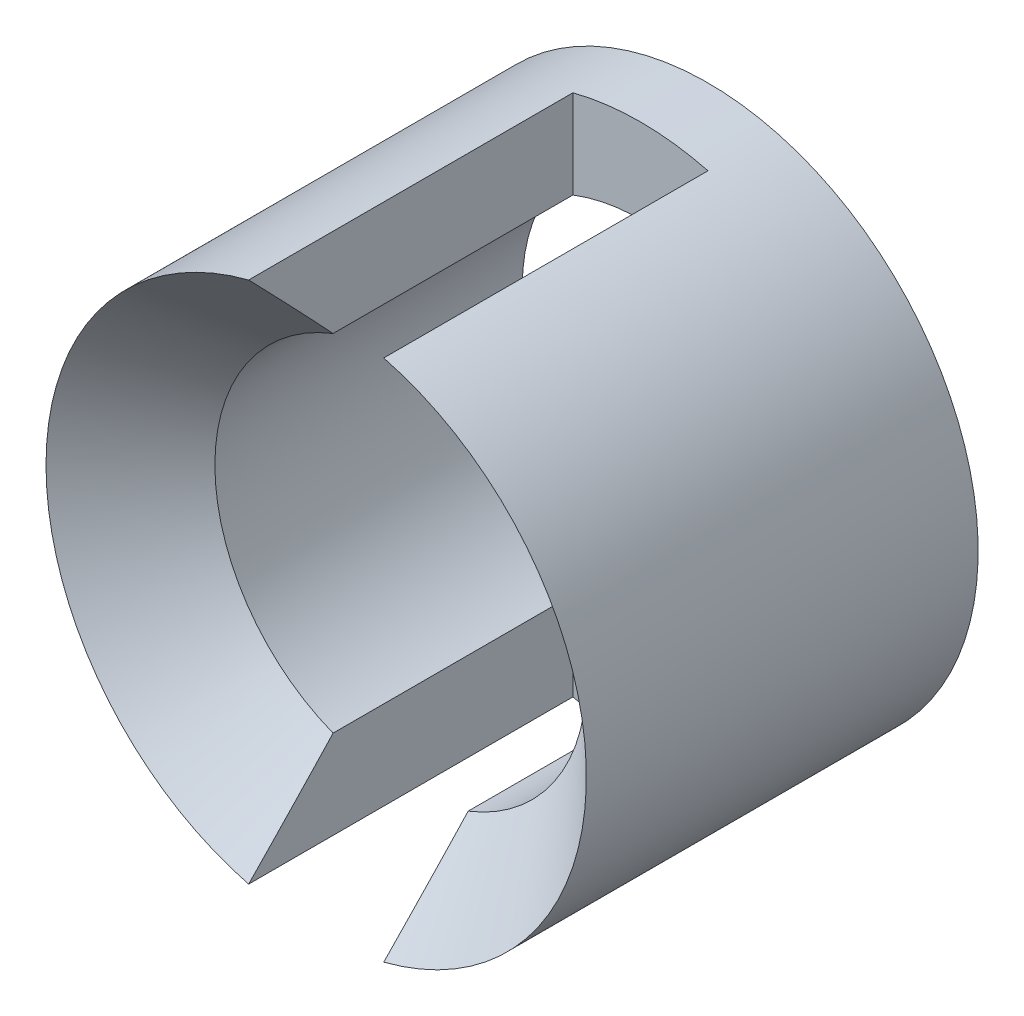
ISO-10303-21;
HEADER;
FILE_DESCRIPTION(('STEP AP214'),'2;1');
FILE_NAME('part.step','',(''),(''),'','','');
FILE_SCHEMA(('AUTOMOTIVE_DESIGN { 1 0 10303 214 1 1 1 1 }'));
ENDSEC;
DATA;
#1=APPLICATION_CONTEXT('core data for automotive mechanical design processes');
#2=APPLICATION_PROTOCOL_DEFINITION('international standard','automotive_design',2000,#1);
#3=PRODUCT_CONTEXT('',#1,'mechanical');
#4=PRODUCT('Part','Part','',(#3));
#5=PRODUCT_RELATED_PRODUCT_CATEGORY('part','',(#4));
#6=PRODUCT_DEFINITION_FORMATION('','',#4);
#7=PRODUCT_DEFINITION_CONTEXT('part definition',#1,'design');
#8=PRODUCT_DEFINITION('design','',#6,#7);
#9=PRODUCT_DEFINITION_SHAPE('','',#8);
#10=(LENGTH_UNIT() NAMED_UNIT(*) SI_UNIT(.MILLI.,.METRE.));
#11=(NAMED_UNIT(*) PLANE_ANGLE_UNIT() SI_UNIT($,.RADIAN.));
#12=(NAMED_UNIT(*) SI_UNIT($,.STERADIAN.) SOLID_ANGLE_UNIT());
#13=UNCERTAINTY_MEASURE_WITH_UNIT(LENGTH_MEASURE(1.E-05),#10,'distance_accuracy_value','');
#14=(GEOMETRIC_REPRESENTATION_CONTEXT(3) GLOBAL_UNCERTAINTY_ASSIGNED_CONTEXT((#13)) GLOBAL_UNIT_ASSIGNED_CONTEXT((#10,
#11,#12)) REPRESENTATION_CONTEXT('',''));
#15=CARTESIAN_POINT('',(0.,0.,0.));
#16=DIRECTION('',(0.,0.,1.));
#17=DIRECTION('',(1.,0.,0.));
#18=AXIS2_PLACEMENT_3D('',#15,#16,#17);
#19=CARTESIAN_POINT('',(52.,0.,35.));
#20=DIRECTION('',(0.,0.,1.));
#21=DIRECTION('',(1.,0.,0.));
#22=AXIS2_PLACEMENT_3D('',#19,#20,#21);
#23=CONICAL_SURFACE('',#22,5.2,0.785398163397448);
#24=CARTESIAN_POINT('',(53.,-3.87370629888224,33.8007));
#25=CARTESIAN_POINT('',(53.,-3.78377847794589,33.7136281605372));
#26=CARTESIAN_POINT('',(53.,-3.69375826152483,33.6266520425625));
#27=CARTESIAN_POINT('',(53.,-3.51348257523246,33.452941561294));
#28=CARTESIAN_POINT('',(53.,-3.42322710220079,33.3662072012807));
#29=CARTESIAN_POINT('',(53.,-3.15193307704452,33.1063474084039));
#30=CARTESIAN_POINT('',(53.,-2.97046894641193,32.9336642756475));
#31=CARTESIAN_POINT('',(53.,-2.69877195793612,32.6779298111269));
#32=CARTESIAN_POINT('',(53.,-2.60925278290297,32.5941206006967));
#33=CARTESIAN_POINT('',(53.,-2.42961319121391,32.4271495738231));
#34=CARTESIAN_POINT('',(53.,-2.33949278018787,32.3439877513334));
#35=CARTESIAN_POINT('',(53.,-2.15846162379619,32.1785719304018));
#36=CARTESIAN_POINT('',(53.,-2.06755107551995,32.096317716564));
#37=CARTESIAN_POINT('',(53.,-1.88460197739564,31.9330743131938));
#38=CARTESIAN_POINT('',(53.,-1.79256347284042,31.8520850731617));
#39=CARTESIAN_POINT('',(53.,-1.64554639333561,31.7253768657511));
#40=CARTESIAN_POINT('',(53.,-1.59111153800493,31.6790278264151));
#41=CARTESIAN_POINT('',(53.,-1.48151988478831,31.587177822305));
#42=CARTESIAN_POINT('',(53.,-1.42636301716185,31.5416769405005));
#43=CARTESIAN_POINT('',(53.,-1.3145253649584,31.4513260014455));
#44=CARTESIAN_POINT('',(53.,-1.25783454923191,31.4064883116032));
#45=CARTESIAN_POINT('',(53.,-1.14321925252981,31.3184211843103));
#46=CARTESIAN_POINT('',(53.,-1.08529490458923,31.2751915747975));
#47=CARTESIAN_POINT('',(53.,-0.966870518316472,31.1903593900541));
#48=CARTESIAN_POINT('',(53.,-0.906344320623961,31.1487930101723));
#49=CARTESIAN_POINT('',(53.,-0.782893162532452,31.0691304507892));
#50=CARTESIAN_POINT('',(53.,-0.71996508720968,31.0310390108286));
#51=CARTESIAN_POINT('',(53.,-0.591863597012872,30.960800107427));
#52=CARTESIAN_POINT('',(53.,-0.526729355427893,30.9285826438723));
#53=CARTESIAN_POINT('',(53.,-0.3929118591497,30.8727214403211));
#54=CARTESIAN_POINT('',(53.,-0.324241529903425,30.8490487006837));
#55=CARTESIAN_POINT('',(53.,-0.221184627158728,30.8236740525048));
#56=CARTESIAN_POINT('',(53.,-0.188023002282163,30.8169859937058));
#57=CARTESIAN_POINT('',(53.,-0.121206142014899,30.8067784844959));
#58=CARTESIAN_POINT('',(53.,-0.0875509450036839,30.8032587890312));
#59=CARTESIAN_POINT('',(53.,-0.0201426921737823,30.7996385884502));
#60=CARTESIAN_POINT('',(53.,0.0136098619022317,30.7995289726332));
#61=CARTESIAN_POINT('',(53.,0.0809476049092378,30.8027050580893));
#62=CARTESIAN_POINT('',(53.,0.114532778163754,30.8059910715994));
#63=CARTESIAN_POINT('',(53.,0.213951812975935,30.8205519989456));
#64=CARTESIAN_POINT('',(53.,0.279130544840012,30.8365003156888));
#65=CARTESIAN_POINT('',(53.,0.374620648857944,30.8674317069862));
#66=CARTESIAN_POINT('',(53.,0.40616696948862,30.8789579181276));
#67=CARTESIAN_POINT('',(53.,0.468488884656917,30.903935312644));
#68=CARTESIAN_POINT('',(53.,0.49926464010403,30.9173860901245));
#69=CARTESIAN_POINT('',(53.,0.592440527855131,30.9609869818209));
#70=CARTESIAN_POINT('',(53.,0.653643966712842,30.9936762384502));
#71=CARTESIAN_POINT('',(53.,0.773581167652545,31.0633487077666));
#72=CARTESIAN_POINT('',(53.,0.832311709344529,31.1003372972856));
#73=CARTESIAN_POINT('',(53.,0.948093136294809,31.1773186573655));
#74=CARTESIAN_POINT('',(53.,1.00513632967926,31.2173228950895));
#75=CARTESIAN_POINT('',(53.,1.11774208035632,31.2992869072952));
#76=CARTESIAN_POINT('',(53.,1.17330537205868,31.3412456822951));
#77=CARTESIAN_POINT('',(53.,1.28406702690465,31.427141749163));
#78=CARTESIAN_POINT('',(53.,1.33925064997076,31.471097960263));
#79=CARTESIAN_POINT('',(53.,1.44875285970882,31.5600772859497));
#80=CARTESIAN_POINT('',(53.,1.50307139372428,31.605100465069));
#81=CARTESIAN_POINT('',(53.,1.66476167209749,31.7411366273418));
#82=CARTESIAN_POINT('',(53.,1.77113835083901,31.8333303987716));
#83=CARTESIAN_POINT('',(53.,1.96398355631301,32.0035374818957));
#84=CARTESIAN_POINT('',(53.,2.05071882596633,32.0812514385124));
#85=CARTESIAN_POINT('',(53.,2.22334975381649,32.2376109481589));
#86=CARTESIAN_POINT('',(53.,2.3092453889987,32.3162565265947));
#87=CARTESIAN_POINT('',(53.,2.56617677190921,32.5533361413158));
#88=CARTESIAN_POINT('',(53.,2.73629220768058,32.7127656592733));
#89=CARTESIAN_POINT('',(53.,3.06815080889591,33.0265786958023));
#90=CARTESIAN_POINT('',(53.,3.22995159688404,33.1809015652407));
#91=CARTESIAN_POINT('',(53.,3.47190857421326,33.4129813713955));
#92=CARTESIAN_POINT('',(53.,3.55239220239384,33.4903972313198));
#93=CARTESIAN_POINT('',(53.,3.71317699014676,33.6454169709719));
#94=CARTESIAN_POINT('',(53.,3.79347815114776,33.7230208492178));
#95=CARTESIAN_POINT('',(53.,3.87370629888224,33.8007));
#96=B_SPLINE_CURVE_WITH_KNOTS('',3,(#24,#25,#26,#27,#28,#29,#30,#31,#32,#33,#34,#35,#36,#37,#38,
#39,#40,#41,#42,#43,#44,#45,#46,#47,#48,#49,#50,#51,#52,#53,#54,#55,#56,#57,#58,#59,#60,#61,#62,
#63,#64,#65,#66,#67,#68,#69,#70,#71,#72,#73,#74,#75,#76,#77,#78,#79,#80,#81,#82,#83,#84,#85,#86,
#87,#88,#89,#90,#91,#92,#93,#94,#95),.UNSPECIFIED.,.F.,.F.,(4,2,2,2,2,2,2,2,2,2,2,2,2,2,2,2,2,2,
2,2,2,2,2,2,2,2,2,2,2,2,2,2,2,2,2,4),(0.,0.375521273518929,0.75104761795945,1.50252682218241,
1.87040917603005,2.23828808990826,2.60607773419094,2.97385265803602,3.1883282096099,
3.40282463293235,3.61964172249639,3.83643554583898,4.05663268672297,4.27712580381501,
4.4947895908717,4.71170755194002,4.81306564528407,4.91441589851793,5.01549535123516,
5.11658409930253,5.31675078921129,5.41747214081756,5.51817228134097,5.72602902840847,
5.93414858038392,6.14310385848396,6.35195343267415,6.56358726575022,6.775233931759,
7.1974932655238,7.54686154766358,7.89623937938663,8.59565822619728,9.26644154249652,
9.60145985579846,9.93647553693495),.UNSPECIFIED.);
#97=CARTESIAN_POINT('',(53.,-3.87298334620741,33.8));
#98=VERTEX_POINT('',#97);
#99=CARTESIAN_POINT('',(53.,-2.5617376914899,32.55));
#100=VERTEX_POINT('',#99);
#101=EDGE_CURVE('E132',#98,#100,#96,.T.);
#102=ORIENTED_EDGE('',*,*,#101,.F.);
#103=CARTESIAN_POINT('',(52.,0.,33.8));
#104=DIRECTION('',(0.,0.,1.));
#105=DIRECTION('',(1.,0.,0.));
#106=AXIS2_PLACEMENT_3D('',#103,#104,#105);
#107=CIRCLE('',#106,3.99999999999999);
#108=CARTESIAN_POINT('',(53.,3.87298334620741,33.8));
#109=VERTEX_POINT('',#108);
#110=EDGE_CURVE('E130',#98,#109,#107,.T.);
#111=ORIENTED_EDGE('',*,*,#110,.T.);
#112=CARTESIAN_POINT('',(53.,2.5617376914899,32.55));
#113=VERTEX_POINT('',#112);
#114=EDGE_CURVE('E123',#113,#109,#96,.T.);
#115=ORIENTED_EDGE('',*,*,#114,.F.);
#116=CARTESIAN_POINT('',(52.,0.,32.55));
#117=DIRECTION('',(0.,0.,1.));
#118=DIRECTION('',(1.,0.,0.));
#119=AXIS2_PLACEMENT_3D('',#116,#117,#118);
#120=CIRCLE('',#119,2.75);
#121=EDGE_CURVE('E115',#100,#113,#120,.T.);
#122=ORIENTED_EDGE('',*,*,#121,.F.);
#123=EDGE_LOOP('',(#102,#111,#115,#122));
#124=FACE_BOUND('',#123,.T.);
#125=ADVANCED_FACE('F39',(#124),#23,.F.);
#126=CARTESIAN_POINT('',(52.,0.,29.));
#127=DIRECTION('',(0.,0.,-1.));
#128=DIRECTION('',(-1.,0.,0.));
#129=AXIS2_PLACEMENT_3D('',#126,#127,#128);
#130=CYLINDRICAL_SURFACE('',#129,3.99999999999999);
#131=CARTESIAN_POINT('',(52.,0.,28.));
#132=DIRECTION('',(0.,0.,-1.));
#133=DIRECTION('',(-1.,0.,0.));
#134=AXIS2_PLACEMENT_3D('',#131,#132,#133);
#135=CIRCLE('',#134,3.99999999999999);
#136=CARTESIAN_POINT('',(48.,0.,28.));
#137=VERTEX_POINT('',#136);
#138=EDGE_CURVE('E152',#137,#137,#135,.T.);
#139=ORIENTED_EDGE('',*,*,#138,.F.);
#140=EDGE_LOOP('',(#139));
#141=FACE_BOUND('',#140,.T.);
#142=CARTESIAN_POINT('',(52.,0.,29.));
#143=DIRECTION('',(0.,0.,-1.));
#144=DIRECTION('',(-1.,0.,0.));
#145=AXIS2_PLACEMENT_3D('',#142,#143,#144);
#146=CIRCLE('',#145,3.99999999999999);
#147=CARTESIAN_POINT('',(53.,3.87298334620741,29.));
#148=VERTEX_POINT('',#147);
#149=CARTESIAN_POINT('',(51.,3.87298334620741,29.));
#150=VERTEX_POINT('',#149);
#151=EDGE_CURVE('E116',#148,#150,#146,.F.);
#152=ORIENTED_EDGE('',*,*,#151,.F.);
#153=DIRECTION('',(0.,0.,-1.));
#154=VECTOR('',#153,1.);
#155=CARTESIAN_POINT('',(53.,3.87298334620741,29.));
#156=LINE('',#155,#154);
#157=EDGE_CURVE('E135',#148,#109,#156,.F.);
#158=ORIENTED_EDGE('',*,*,#157,.T.);
#159=ORIENTED_EDGE('',*,*,#110,.F.);
#160=DIRECTION('',(0.,0.,-1.));
#161=VECTOR('',#160,1.);
#162=CARTESIAN_POINT('',(53.,-3.87298334620741,29.));
#163=LINE('',#162,#161);
#164=CARTESIAN_POINT('',(53.,-3.87298334620741,29.));
#165=VERTEX_POINT('',#164);
#166=EDGE_CURVE('E120',#98,#165,#163,.T.);
#167=ORIENTED_EDGE('',*,*,#166,.T.);
#168=CARTESIAN_POINT('',(51.,-3.87298334620741,29.));
#169=VERTEX_POINT('',#168);
#170=EDGE_CURVE('E107',#169,#165,#146,.F.);
#171=ORIENTED_EDGE('',*,*,#170,.F.);
#172=DIRECTION('',(0.,0.,-1.));
#173=VECTOR('',#172,1.);
#174=CARTESIAN_POINT('',(51.,-3.87298334620741,29.));
#175=LINE('',#174,#173);
#176=CARTESIAN_POINT('',(51.,-3.8729833462074,33.8));
#177=VERTEX_POINT('',#176);
#178=EDGE_CURVE('E144',#177,#169,#175,.T.);
#179=ORIENTED_EDGE('',*,*,#178,.F.);
#180=CARTESIAN_POINT('',(51.,3.8729833462074,33.8));
#181=VERTEX_POINT('',#180);
#182=EDGE_CURVE('E156',#181,#177,#107,.T.);
#183=ORIENTED_EDGE('',*,*,#182,.F.);
#184=DIRECTION('',(0.,0.,-1.));
#185=VECTOR('',#184,1.);
#186=CARTESIAN_POINT('',(51.,3.87298334620741,29.));
#187=LINE('',#186,#185);
#188=EDGE_CURVE('E62',#150,#181,#187,.F.);
#189=ORIENTED_EDGE('',*,*,#188,.F.);
#190=EDGE_LOOP('',(#152,#158,#159,#167,#171,#179,#183,#189));
#191=FACE_BOUND('',#190,.T.);
#192=ADVANCED_FACE('F127',(#141,#191),#130,.T.);
#193=CARTESIAN_POINT('',(52.,0.,35.));
#194=DIRECTION('',(0.,0.,1.));
#195=DIRECTION('',(1.,0.,0.));
#196=AXIS2_PLACEMENT_3D('',#193,#194,#195);
#197=CYLINDRICAL_SURFACE('',#196,2.75);
#198=CARTESIAN_POINT('',(52.,0.,28.));
#199=DIRECTION('',(0.,0.,-1.));
#200=DIRECTION('',(-1.,0.,0.));
#201=AXIS2_PLACEMENT_3D('',#198,#199,#200);
#202=CIRCLE('',#201,2.75);
#203=CARTESIAN_POINT('',(49.25,0.,28.));
#204=VERTEX_POINT('',#203);
#205=EDGE_CURVE('E149',#204,#204,#202,.T.);
#206=ORIENTED_EDGE('',*,*,#205,.T.);
#207=EDGE_LOOP('',(#206));
#208=FACE_BOUND('',#207,.T.);
#209=CARTESIAN_POINT('',(52.,0.,29.));
#210=DIRECTION('',(0.,0.,-1.));
#211=DIRECTION('',(-1.,0.,0.));
#212=AXIS2_PLACEMENT_3D('',#209,#210,#211);
#213=CIRCLE('',#212,2.75);
#214=CARTESIAN_POINT('',(51.,-2.56173769148989,29.));
#215=VERTEX_POINT('',#214);
#216=CARTESIAN_POINT('',(53.,-2.5617376914899,29.));
#217=VERTEX_POINT('',#216);
#218=EDGE_CURVE('E204',#215,#217,#213,.F.);
#219=ORIENTED_EDGE('',*,*,#218,.T.);
#220=DIRECTION('',(0.,0.,1.));
#221=VECTOR('',#220,1.);
#222=CARTESIAN_POINT('',(53.,-2.5617376914899,35.));
#223=LINE('',#222,#221);
#224=EDGE_CURVE('E11',#100,#217,#223,.F.);
#225=ORIENTED_EDGE('',*,*,#224,.F.);
#226=ORIENTED_EDGE('',*,*,#121,.T.);
#227=DIRECTION('',(0.,0.,1.));
#228=VECTOR('',#227,1.);
#229=CARTESIAN_POINT('',(53.,2.5617376914899,35.));
#230=LINE('',#229,#228);
#231=CARTESIAN_POINT('',(53.,2.5617376914899,29.));
#232=VERTEX_POINT('',#231);
#233=EDGE_CURVE('E47',#232,#113,#230,.T.);
#234=ORIENTED_EDGE('',*,*,#233,.F.);
#235=CARTESIAN_POINT('',(51.,2.56173769148989,29.));
#236=VERTEX_POINT('',#235);
#237=EDGE_CURVE('E166',#232,#236,#213,.F.);
#238=ORIENTED_EDGE('',*,*,#237,.T.);
#239=DIRECTION('',(0.,0.,1.));
#240=VECTOR('',#239,1.);
#241=CARTESIAN_POINT('',(51.,2.56173769148989,35.));
#242=LINE('',#241,#240);
#243=CARTESIAN_POINT('',(51.,2.56173769149006,32.5500000000001));
#244=VERTEX_POINT('',#243);
#245=EDGE_CURVE('E139',#236,#244,#242,.T.);
#246=ORIENTED_EDGE('',*,*,#245,.T.);
#247=CARTESIAN_POINT('',(51.,-2.5617376914899,32.55));
#248=VERTEX_POINT('',#247);
#249=EDGE_CURVE('E148',#244,#248,#120,.T.);
#250=ORIENTED_EDGE('',*,*,#249,.T.);
#251=DIRECTION('',(0.,0.,1.));
#252=VECTOR('',#251,1.);
#253=CARTESIAN_POINT('',(51.,-2.56173769148989,35.));
#254=LINE('',#253,#252);
#255=EDGE_CURVE('E54',#248,#215,#254,.F.);
#256=ORIENTED_EDGE('',*,*,#255,.T.);
#257=EDGE_LOOP('',(#219,#225,#226,#234,#238,#246,#250,#256));
#258=FACE_BOUND('',#257,.T.);
#259=ADVANCED_FACE('F191',(#208,#258),#197,.F.);
#260=CARTESIAN_POINT('',(52.,0.,28.));
#261=DIRECTION('',(0.,0.,-1.));
#262=DIRECTION('',(-1.,0.,0.));
#263=AXIS2_PLACEMENT_3D('',#260,#261,#262);
#264=PLANE('',#263);
#265=ORIENTED_EDGE('',*,*,#205,.F.);
#266=EDGE_LOOP('',(#265));
#267=FACE_BOUND('',#266,.T.);
#268=ORIENTED_EDGE('',*,*,#138,.T.);
#269=EDGE_LOOP('',(#268));
#270=FACE_BOUND('',#269,.T.);
#271=ADVANCED_FACE('F41',(#267,#270),#264,.T.);
#272=ORIENTED_EDGE('',*,*,#182,.T.);
#273=CARTESIAN_POINT('',(51.,-3.87370629888223,33.8007));
#274=CARTESIAN_POINT('',(51.,-3.78377847794589,33.7136281605372));
#275=CARTESIAN_POINT('',(51.,-3.69375826152482,33.6266520425625));
#276=CARTESIAN_POINT('',(51.,-3.51348257523247,33.4529415612941));
#277=CARTESIAN_POINT('',(51.,-3.4232271022008,33.3662072012807));
#278=CARTESIAN_POINT('',(51.,-3.15193307704455,33.1063474084039));
#279=CARTESIAN_POINT('',(51.,-2.97046894641197,32.9336642756476));
#280=CARTESIAN_POINT('',(51.,-2.69877195793617,32.677929811127));
#281=CARTESIAN_POINT('',(51.,-2.60925278290302,32.5941206006968));
#282=CARTESIAN_POINT('',(51.,-2.42961319121397,32.4271495738232));
#283=CARTESIAN_POINT('',(51.,-2.33949278018794,32.3439877513335));
#284=CARTESIAN_POINT('',(51.,-2.15846162379627,32.1785719304019));
#285=CARTESIAN_POINT('',(51.,-2.06755107552003,32.0963177165641));
#286=CARTESIAN_POINT('',(51.,-1.88460197739573,31.9330743131939));
#287=CARTESIAN_POINT('',(51.,-1.79256347284051,31.8520850731618));
#288=CARTESIAN_POINT('',(51.,-1.64554639333571,31.7253768657512));
#289=CARTESIAN_POINT('',(51.,-1.59111153800502,31.6790278264152));
#290=CARTESIAN_POINT('',(51.,-1.4815198847884,31.5871778223051));
#291=CARTESIAN_POINT('',(51.,-1.42636301716193,31.5416769405006));
#292=CARTESIAN_POINT('',(51.,-1.31452536495848,31.4513260014456));
#293=CARTESIAN_POINT('',(51.,-1.25783454923198,31.4064883116033));
#294=CARTESIAN_POINT('',(51.,-1.14321925252989,31.3184211843103));
#295=CARTESIAN_POINT('',(51.,-1.0852949045893,31.2751915747976));
#296=CARTESIAN_POINT('',(51.,-0.966870518316534,31.1903593900542));
#297=CARTESIAN_POINT('',(51.,-0.90634432062402,31.1487930101723));
#298=CARTESIAN_POINT('',(51.,-0.782893162532506,31.0691304507893));
#299=CARTESIAN_POINT('',(51.,-0.719965087209733,31.0310390108286));
#300=CARTESIAN_POINT('',(51.,-0.591863597012921,30.9608001074271));
#301=CARTESIAN_POINT('',(51.,-0.526729355427939,30.9285826438724));
#302=CARTESIAN_POINT('',(51.,-0.392911859149739,30.8727214403211));
#303=CARTESIAN_POINT('',(51.,-0.32424152990346,30.8490487006838));
#304=CARTESIAN_POINT('',(51.,-0.221184627158757,30.8236740525049));
#305=CARTESIAN_POINT('',(51.,-0.188023002282191,30.8169859937059));
#306=CARTESIAN_POINT('',(51.,-0.121206142014925,30.806778484496));
#307=CARTESIAN_POINT('',(51.,-0.0875509450037081,30.8032587890313));
#308=CARTESIAN_POINT('',(51.,-0.0201426921738039,30.7996385884502));
#309=CARTESIAN_POINT('',(51.,0.0136098619022113,30.7995289726332));
#310=CARTESIAN_POINT('',(51.,0.0809476049092198,30.8027050580893));
#311=CARTESIAN_POINT('',(51.,0.114532778163737,30.8059910715994));
#312=CARTESIAN_POINT('',(51.,0.213951812975923,30.8205519989457));
#313=CARTESIAN_POINT('',(51.,0.279130544840002,30.8365003156888));
#314=CARTESIAN_POINT('',(51.,0.374620648857938,30.8674317069862));
#315=CARTESIAN_POINT('',(51.,0.406166969488616,30.8789579181276));
#316=CARTESIAN_POINT('',(51.,0.468488884656916,30.903935312644));
#317=CARTESIAN_POINT('',(51.,0.499264640104031,30.9173860901245));
#318=CARTESIAN_POINT('',(51.,0.592440527855132,30.9609869818209));
#319=CARTESIAN_POINT('',(51.,0.653643966712842,30.9936762384502));
#320=CARTESIAN_POINT('',(51.,0.773581167652545,31.0633487077667));
#321=CARTESIAN_POINT('',(51.,0.83231170934453,31.1003372972856));
#322=CARTESIAN_POINT('',(51.,0.948093136294809,31.1773186573655));
#323=CARTESIAN_POINT('',(51.,1.00513632967926,31.2173228950895));
#324=CARTESIAN_POINT('',(51.,1.11774208035631,31.2992869072952));
#325=CARTESIAN_POINT('',(51.,1.17330537205867,31.3412456822951));
#326=CARTESIAN_POINT('',(51.,1.28406702690464,31.427141749163));
#327=CARTESIAN_POINT('',(51.,1.33925064997075,31.471097960263));
#328=CARTESIAN_POINT('',(51.,1.44875285970881,31.5600772859497));
#329=CARTESIAN_POINT('',(51.,1.50307139372427,31.605100465069));
#330=CARTESIAN_POINT('',(51.,1.66476167209747,31.7411366273418));
#331=CARTESIAN_POINT('',(51.,1.771138350839,31.8333303987716));
#332=CARTESIAN_POINT('',(51.,1.96398355631299,32.0035374818957));
#333=CARTESIAN_POINT('',(51.,2.05071882596631,32.0812514385124));
#334=CARTESIAN_POINT('',(51.,2.22334975381647,32.2376109481589));
#335=CARTESIAN_POINT('',(51.,2.30924538899868,32.3162565265947));
#336=CARTESIAN_POINT('',(51.,2.56617677190919,32.5533361413158));
#337=CARTESIAN_POINT('',(51.,2.73629220768056,32.7127656592733));
#338=CARTESIAN_POINT('',(51.,3.0681508088959,33.0265786958023));
#339=CARTESIAN_POINT('',(51.,3.22995159688403,33.1809015652407));
#340=CARTESIAN_POINT('',(51.,3.47190857421325,33.4129813713955));
#341=CARTESIAN_POINT('',(51.,3.55239220239383,33.4903972313198));
#342=CARTESIAN_POINT('',(51.,3.71317699014675,33.6454169709719));
#343=CARTESIAN_POINT('',(51.,3.79347815114774,33.7230208492178));
#344=CARTESIAN_POINT('',(51.,3.87370629888223,33.8007));
#345=B_SPLINE_CURVE_WITH_KNOTS('',3,(#273,#274,#275,#276,#277,#278,#279,#280,#281,#282,#283,
#284,#285,#286,#287,#288,#289,#290,#291,#292,#293,#294,#295,#296,#297,#298,#299,#300,#301,#302,
#303,#304,#305,#306,#307,#308,#309,#310,#311,#312,#313,#314,#315,#316,#317,#318,#319,#320,#321,
#322,#323,#324,#325,#326,#327,#328,#329,#330,#331,#332,#333,#334,#335,#336,#337,#338,#339,#340,
#341,#342,#343,#344),.UNSPECIFIED.,.F.,.F.,(4,2,2,2,2,2,2,2,2,2,2,2,2,2,2,2,2,2,2,2,2,2,2,2,2,2,
2,2,2,2,2,2,2,2,2,4),(0.,0.375521273518912,0.751047617959418,1.50252682218234,1.87040917602996,
2.23828808990815,2.60607773419082,2.97385265803587,3.18832820960976,3.40282463293223,
3.61964172249628,3.83643554583889,4.05663268672288,4.27712580381494,4.49478959087163,
4.71170755193997,4.81306564528403,4.91441589851789,5.01549535123512,5.1165840993025,
5.31675078921126,5.41747214081754,5.51817228134095,5.72602902840844,5.93414858038389,
6.14310385848393,6.35195343267412,6.56358726575019,6.77523393175896,7.19749326552375,
7.54686154766353,7.89623937938658,8.59565822619722,9.26644154249647,9.60145985579841,
9.9364755369349),.UNSPECIFIED.);
#346=EDGE_CURVE('E165',#177,#248,#345,.T.);
#347=ORIENTED_EDGE('',*,*,#346,.T.);
#348=ORIENTED_EDGE('',*,*,#249,.F.);
#349=EDGE_CURVE('E155',#244,#181,#345,.T.);
#350=ORIENTED_EDGE('',*,*,#349,.T.);
#351=EDGE_LOOP('',(#272,#347,#348,#350));
#352=FACE_BOUND('',#351,.T.);
#353=ADVANCED_FACE('F167',(#352),#23,.F.);
#354=CARTESIAN_POINT('',(51.,-3.99999999999999,29.));
#355=DIRECTION('',(-1.,0.,0.));
#356=DIRECTION('',(0.,0.,1.));
#357=AXIS2_PLACEMENT_3D('',#354,#355,#356);
#358=PLANE('',#357);
#359=ORIENTED_EDGE('',*,*,#188,.T.);
#360=ORIENTED_EDGE('',*,*,#349,.F.);
#361=ORIENTED_EDGE('',*,*,#245,.F.);
#362=DIRECTION('',(0.,1.,0.));
#363=VECTOR('',#362,1.);
#364=CARTESIAN_POINT('',(51.,-3.99999999999999,29.));
#365=LINE('',#364,#363);
#366=EDGE_CURVE('E131',#236,#150,#365,.T.);
#367=ORIENTED_EDGE('',*,*,#366,.T.);
#368=EDGE_LOOP('',(#359,#360,#361,#367));
#369=FACE_BOUND('',#368,.T.);
#370=ADVANCED_FACE('F171',(#369),#358,.F.);
#371=CARTESIAN_POINT('',(52.,-3.99999999999999,29.));
#372=DIRECTION('',(0.,0.,-1.));
#373=DIRECTION('',(-1.,0.,0.));
#374=AXIS2_PLACEMENT_3D('',#371,#372,#373);
#375=PLANE('',#374);
#376=ORIENTED_EDGE('',*,*,#151,.T.);
#377=ORIENTED_EDGE('',*,*,#366,.F.);
#378=ORIENTED_EDGE('',*,*,#237,.F.);
#379=DIRECTION('',(0.,1.,0.));
#380=VECTOR('',#379,1.);
#381=CARTESIAN_POINT('',(53.,-3.99999999999999,29.));
#382=LINE('',#381,#380);
#383=EDGE_CURVE('E124',#232,#148,#382,.T.);
#384=ORIENTED_EDGE('',*,*,#383,.T.);
#385=EDGE_LOOP('',(#376,#377,#378,#384));
#386=FACE_BOUND('',#385,.T.);
#387=ADVANCED_FACE('F175',(#386),#375,.F.);
#388=ORIENTED_EDGE('',*,*,#170,.T.);
#389=EDGE_CURVE('E110',#165,#217,#382,.T.);
#390=ORIENTED_EDGE('',*,*,#389,.T.);
#391=ORIENTED_EDGE('',*,*,#218,.F.);
#392=EDGE_CURVE('E111',#169,#215,#365,.T.);
#393=ORIENTED_EDGE('',*,*,#392,.F.);
#394=EDGE_LOOP('',(#388,#390,#391,#393));
#395=FACE_BOUND('',#394,.T.);
#396=ADVANCED_FACE('F109',(#395),#375,.F.);
#397=ORIENTED_EDGE('',*,*,#178,.T.);
#398=ORIENTED_EDGE('',*,*,#392,.T.);
#399=ORIENTED_EDGE('',*,*,#255,.F.);
#400=ORIENTED_EDGE('',*,*,#346,.F.);
#401=EDGE_LOOP('',(#397,#398,#399,#400));
#402=FACE_BOUND('',#401,.T.);
#403=ADVANCED_FACE('F176',(#402),#358,.F.);
#404=CARTESIAN_POINT('',(53.,-3.99999999999999,29.));
#405=DIRECTION('',(-1.,0.,0.));
#406=DIRECTION('',(0.,0.,1.));
#407=AXIS2_PLACEMENT_3D('',#404,#405,#406);
#408=PLANE('',#407);
#409=ORIENTED_EDGE('',*,*,#101,.T.);
#410=ORIENTED_EDGE('',*,*,#224,.T.);
#411=ORIENTED_EDGE('',*,*,#389,.F.);
#412=ORIENTED_EDGE('',*,*,#166,.F.);
#413=EDGE_LOOP('',(#409,#410,#411,#412));
#414=FACE_BOUND('',#413,.T.);
#415=ADVANCED_FACE('F119',(#414),#408,.T.);
#416=ORIENTED_EDGE('',*,*,#383,.F.);
#417=ORIENTED_EDGE('',*,*,#233,.T.);
#418=ORIENTED_EDGE('',*,*,#114,.T.);
#419=ORIENTED_EDGE('',*,*,#157,.F.);
#420=EDGE_LOOP('',(#416,#417,#418,#419));
#421=FACE_BOUND('',#420,.T.);
#422=ADVANCED_FACE('F177',(#421),#408,.T.);
#423=CLOSED_SHELL('',(#125,#192,#259,#271,#353,#370,#387,#396,#403,#415,#422));
#424=MANIFOLD_SOLID_BREP('B2',#423);
#425=ADVANCED_BREP_SHAPE_REPRESENTATION('',(#18,#424),#14);
#426=SHAPE_DEFINITION_REPRESENTATION(#9,#425);
ENDSEC;
END-ISO-10303-21;
